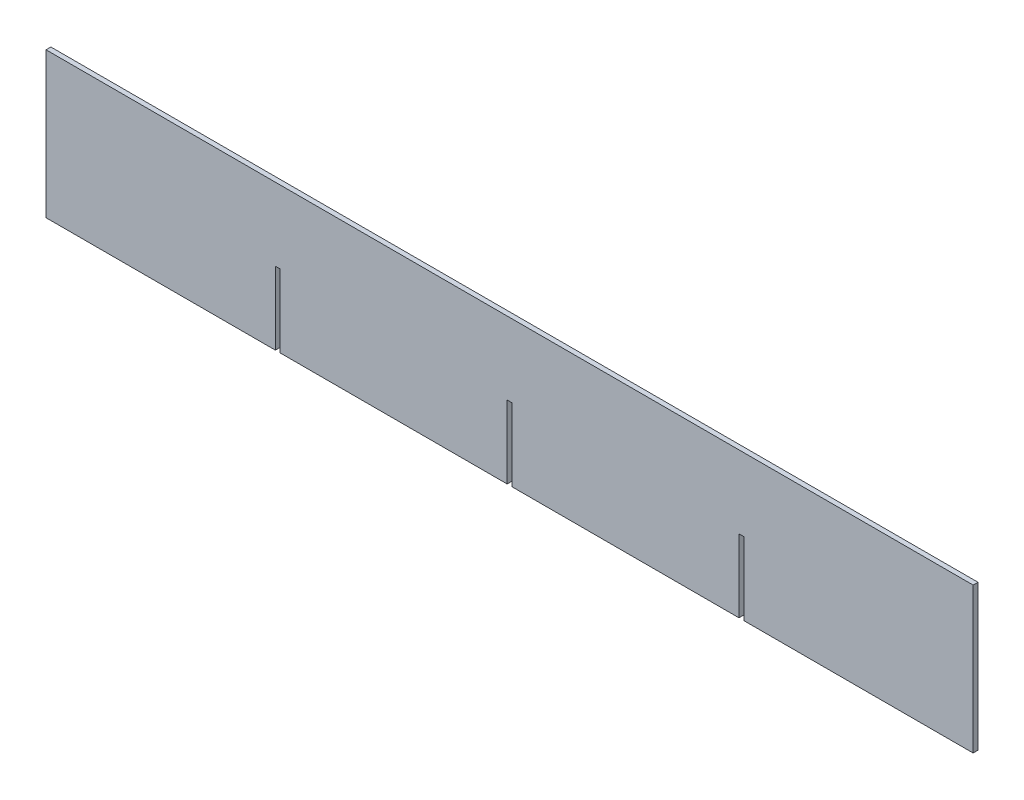
ISO-10303-21;
HEADER;
FILE_DESCRIPTION(('STEP AP214'),'2;1');
FILE_NAME('part.step','',(''),(''),'','','');
FILE_SCHEMA(('AUTOMOTIVE_DESIGN { 1 0 10303 214 1 1 1 1 }'));
ENDSEC;
DATA;
#1=APPLICATION_CONTEXT('core data for automotive mechanical design processes');
#2=APPLICATION_PROTOCOL_DEFINITION('international standard','automotive_design',2000,#1);
#3=PRODUCT_CONTEXT('',#1,'mechanical');
#4=PRODUCT('Part','Part','',(#3));
#5=PRODUCT_RELATED_PRODUCT_CATEGORY('part','',(#4));
#6=PRODUCT_DEFINITION_FORMATION('','',#4);
#7=PRODUCT_DEFINITION_CONTEXT('part definition',#1,'design');
#8=PRODUCT_DEFINITION('design','',#6,#7);
#9=PRODUCT_DEFINITION_SHAPE('','',#8);
#10=(LENGTH_UNIT() NAMED_UNIT(*) SI_UNIT(.MILLI.,.METRE.));
#11=(NAMED_UNIT(*) PLANE_ANGLE_UNIT() SI_UNIT($,.RADIAN.));
#12=(NAMED_UNIT(*) SI_UNIT($,.STERADIAN.) SOLID_ANGLE_UNIT());
#13=UNCERTAINTY_MEASURE_WITH_UNIT(LENGTH_MEASURE(1.E-05),#10,'distance_accuracy_value','');
#14=(GEOMETRIC_REPRESENTATION_CONTEXT(3) GLOBAL_UNCERTAINTY_ASSIGNED_CONTEXT((#13)) GLOBAL_UNIT_ASSIGNED_CONTEXT((#10,
#11,#12)) REPRESENTATION_CONTEXT('',''));
#15=CARTESIAN_POINT('',(0.,0.,0.));
#16=DIRECTION('',(0.,0.,1.));
#17=DIRECTION('',(1.,0.,0.));
#18=AXIS2_PLACEMENT_3D('',#15,#16,#17);
#19=CARTESIAN_POINT('',(239.,37.5,1.25));
#20=DIRECTION('',(-1.,0.,0.));
#21=DIRECTION('',(0.,0.,1.));
#22=AXIS2_PLACEMENT_3D('',#19,#20,#21);
#23=PLANE('',#22);
#24=DIRECTION('',(0.,1.,0.));
#25=VECTOR('',#24,1.);
#26=CARTESIAN_POINT('',(239.,37.5,-1.25));
#27=LINE('',#26,#25);
#28=CARTESIAN_POINT('',(239.,-37.5,-1.25));
#29=VERTEX_POINT('',#28);
#30=CARTESIAN_POINT('',(239.,37.5,-1.25));
#31=VERTEX_POINT('',#30);
#32=EDGE_CURVE('E190',#29,#31,#27,.T.);
#33=ORIENTED_EDGE('',*,*,#32,.T.);
#34=DIRECTION('',(0.,0.,-1.));
#35=VECTOR('',#34,1.);
#36=CARTESIAN_POINT('',(239.,37.5,1.25));
#37=LINE('',#36,#35);
#38=CARTESIAN_POINT('',(239.,37.5,1.25));
#39=VERTEX_POINT('',#38);
#40=EDGE_CURVE('E11',#39,#31,#37,.T.);
#41=ORIENTED_EDGE('',*,*,#40,.F.);
#42=DIRECTION('',(0.,1.,0.));
#43=VECTOR('',#42,1.);
#44=CARTESIAN_POINT('',(239.,37.5,1.25));
#45=LINE('',#44,#43);
#46=CARTESIAN_POINT('',(239.,-37.5,1.25));
#47=VERTEX_POINT('',#46);
#48=EDGE_CURVE('E236',#47,#39,#45,.T.);
#49=ORIENTED_EDGE('',*,*,#48,.F.);
#50=DIRECTION('',(0.,0.,-1.));
#51=VECTOR('',#50,1.);
#52=CARTESIAN_POINT('',(239.,-37.5,1.25));
#53=LINE('',#52,#51);
#54=EDGE_CURVE('E186',#47,#29,#53,.T.);
#55=ORIENTED_EDGE('',*,*,#54,.T.);
#56=EDGE_LOOP('',(#33,#41,#49,#55));
#57=FACE_BOUND('',#56,.T.);
#58=ADVANCED_FACE('F41',(#57),#23,.F.);
#59=CARTESIAN_POINT('',(-239.,37.5,1.25));
#60=DIRECTION('',(0.,-1.,0.));
#61=DIRECTION('',(0.,0.,-1.));
#62=AXIS2_PLACEMENT_3D('',#59,#60,#61);
#63=PLANE('',#62);
#64=DIRECTION('',(-1.,0.,0.));
#65=VECTOR('',#64,1.);
#66=CARTESIAN_POINT('',(-239.,37.5,-1.25));
#67=LINE('',#66,#65);
#68=CARTESIAN_POINT('',(-239.,37.5,-1.25));
#69=VERTEX_POINT('',#68);
#70=EDGE_CURVE('E194',#31,#69,#67,.T.);
#71=ORIENTED_EDGE('',*,*,#70,.T.);
#72=DIRECTION('',(0.,0.,-1.));
#73=VECTOR('',#72,1.);
#74=CARTESIAN_POINT('',(-239.,37.5,1.25));
#75=LINE('',#74,#73);
#76=CARTESIAN_POINT('',(-239.,37.5,1.25));
#77=VERTEX_POINT('',#76);
#78=EDGE_CURVE('E50',#77,#69,#75,.T.);
#79=ORIENTED_EDGE('',*,*,#78,.F.);
#80=DIRECTION('',(-1.,0.,0.));
#81=VECTOR('',#80,1.);
#82=CARTESIAN_POINT('',(-239.,37.5,1.25));
#83=LINE('',#82,#81);
#84=EDGE_CURVE('E125',#39,#77,#83,.T.);
#85=ORIENTED_EDGE('',*,*,#84,.F.);
#86=ORIENTED_EDGE('',*,*,#40,.T.);
#87=EDGE_LOOP('',(#71,#79,#85,#86));
#88=FACE_BOUND('',#87,.T.);
#89=ADVANCED_FACE('F358',(#88),#63,.F.);
#90=CARTESIAN_POINT('',(-239.,-37.5,1.25));
#91=DIRECTION('',(1.,0.,0.));
#92=DIRECTION('',(0.,0.,-1.));
#93=AXIS2_PLACEMENT_3D('',#90,#91,#92);
#94=PLANE('',#93);
#95=DIRECTION('',(0.,-1.,0.));
#96=VECTOR('',#95,1.);
#97=CARTESIAN_POINT('',(-239.,-37.5,-1.25));
#98=LINE('',#97,#96);
#99=CARTESIAN_POINT('',(-239.,-37.5,-1.25));
#100=VERTEX_POINT('',#99);
#101=EDGE_CURVE('E197',#69,#100,#98,.T.);
#102=ORIENTED_EDGE('',*,*,#101,.T.);
#103=DIRECTION('',(0.,0.,-1.));
#104=VECTOR('',#103,1.);
#105=CARTESIAN_POINT('',(-239.,-37.5,1.25));
#106=LINE('',#105,#104);
#107=CARTESIAN_POINT('',(-239.,-37.5,1.25));
#108=VERTEX_POINT('',#107);
#109=EDGE_CURVE('E279',#108,#100,#106,.T.);
#110=ORIENTED_EDGE('',*,*,#109,.F.);
#111=DIRECTION('',(0.,-1.,0.));
#112=VECTOR('',#111,1.);
#113=CARTESIAN_POINT('',(-239.,-37.5,1.25));
#114=LINE('',#113,#112);
#115=EDGE_CURVE('E289',#77,#108,#114,.T.);
#116=ORIENTED_EDGE('',*,*,#115,.F.);
#117=ORIENTED_EDGE('',*,*,#78,.T.);
#118=EDGE_LOOP('',(#102,#110,#116,#117));
#119=FACE_BOUND('',#118,.T.);
#120=ADVANCED_FACE('F287',(#119),#94,.F.);
#121=CARTESIAN_POINT('',(-120.75,-37.5,1.25));
#122=DIRECTION('',(0.,1.,0.));
#123=DIRECTION('',(0.,0.,1.));
#124=AXIS2_PLACEMENT_3D('',#121,#122,#123);
#125=PLANE('',#124);
#126=DIRECTION('',(1.,0.,0.));
#127=VECTOR('',#126,1.);
#128=CARTESIAN_POINT('',(-120.75,-37.5,-1.25));
#129=LINE('',#128,#127);
#130=CARTESIAN_POINT('',(-120.75,-37.5,-1.25));
#131=VERTEX_POINT('',#130);
#132=EDGE_CURVE('E200',#100,#131,#129,.T.);
#133=ORIENTED_EDGE('',*,*,#132,.T.);
#134=DIRECTION('',(0.,0.,-1.));
#135=VECTOR('',#134,1.);
#136=CARTESIAN_POINT('',(-120.75,-37.5,1.25));
#137=LINE('',#136,#135);
#138=CARTESIAN_POINT('',(-120.75,-37.5,1.25));
#139=VERTEX_POINT('',#138);
#140=EDGE_CURVE('E275',#139,#131,#137,.T.);
#141=ORIENTED_EDGE('',*,*,#140,.F.);
#142=DIRECTION('',(1.,0.,0.));
#143=VECTOR('',#142,1.);
#144=CARTESIAN_POINT('',(-120.75,-37.5,1.25));
#145=LINE('',#144,#143);
#146=EDGE_CURVE('E308',#108,#139,#145,.T.);
#147=ORIENTED_EDGE('',*,*,#146,.F.);
#148=ORIENTED_EDGE('',*,*,#109,.T.);
#149=EDGE_LOOP('',(#133,#141,#147,#148));
#150=FACE_BOUND('',#149,.T.);
#151=ADVANCED_FACE('F298',(#150),#125,.F.);
#152=CARTESIAN_POINT('',(-120.75,-37.5,1.25));
#153=DIRECTION('',(-1.,0.,0.));
#154=DIRECTION('',(0.,-1.,0.));
#155=AXIS2_PLACEMENT_3D('',#152,#153,#154);
#156=PLANE('',#155);
#157=DIRECTION('',(0.,1.,0.));
#158=VECTOR('',#157,1.);
#159=CARTESIAN_POINT('',(-120.75,-37.5,-1.25));
#160=LINE('',#159,#158);
#161=CARTESIAN_POINT('',(-120.75,0.,-1.25));
#162=VERTEX_POINT('',#161);
#163=EDGE_CURVE('E203',#131,#162,#160,.T.);
#164=ORIENTED_EDGE('',*,*,#163,.T.);
#165=DIRECTION('',(0.,0.,-1.));
#166=VECTOR('',#165,1.);
#167=CARTESIAN_POINT('',(-120.75,0.,1.25));
#168=LINE('',#167,#166);
#169=CARTESIAN_POINT('',(-120.75,0.,1.25));
#170=VERTEX_POINT('',#169);
#171=EDGE_CURVE('E271',#170,#162,#168,.T.);
#172=ORIENTED_EDGE('',*,*,#171,.F.);
#173=DIRECTION('',(0.,1.,0.));
#174=VECTOR('',#173,1.);
#175=CARTESIAN_POINT('',(-120.75,-37.5,1.25));
#176=LINE('',#175,#174);
#177=EDGE_CURVE('E304',#139,#170,#176,.T.);
#178=ORIENTED_EDGE('',*,*,#177,.F.);
#179=ORIENTED_EDGE('',*,*,#140,.T.);
#180=EDGE_LOOP('',(#164,#172,#178,#179));
#181=FACE_BOUND('',#180,.T.);
#182=ADVANCED_FACE('F302',(#181),#156,.F.);
#183=CARTESIAN_POINT('',(-120.75,0.,1.25));
#184=DIRECTION('',(0.,1.,0.));
#185=DIRECTION('',(0.,0.,1.));
#186=AXIS2_PLACEMENT_3D('',#183,#184,#185);
#187=PLANE('',#186);
#188=DIRECTION('',(1.,0.,0.));
#189=VECTOR('',#188,1.);
#190=CARTESIAN_POINT('',(-120.75,0.,-1.25));
#191=LINE('',#190,#189);
#192=CARTESIAN_POINT('',(-118.25,0.,-1.25));
#193=VERTEX_POINT('',#192);
#194=EDGE_CURVE('E206',#162,#193,#191,.T.);
#195=ORIENTED_EDGE('',*,*,#194,.T.);
#196=DIRECTION('',(0.,0.,-1.));
#197=VECTOR('',#196,1.);
#198=CARTESIAN_POINT('',(-118.25,0.,1.25));
#199=LINE('',#198,#197);
#200=CARTESIAN_POINT('',(-118.25,0.,1.25));
#201=VERTEX_POINT('',#200);
#202=EDGE_CURVE('E267',#201,#193,#199,.T.);
#203=ORIENTED_EDGE('',*,*,#202,.F.);
#204=DIRECTION('',(1.,0.,0.));
#205=VECTOR('',#204,1.);
#206=CARTESIAN_POINT('',(-120.75,0.,1.25));
#207=LINE('',#206,#205);
#208=EDGE_CURVE('E307',#170,#201,#207,.T.);
#209=ORIENTED_EDGE('',*,*,#208,.F.);
#210=ORIENTED_EDGE('',*,*,#171,.T.);
#211=EDGE_LOOP('',(#195,#203,#209,#210));
#212=FACE_BOUND('',#211,.T.);
#213=ADVANCED_FACE('F371',(#212),#187,.F.);
#214=CARTESIAN_POINT('',(-118.25,-37.5,1.25));
#215=DIRECTION('',(1.,0.,0.));
#216=DIRECTION('',(0.,0.,-1.));
#217=AXIS2_PLACEMENT_3D('',#214,#215,#216);
#218=PLANE('',#217);
#219=DIRECTION('',(0.,-1.,0.));
#220=VECTOR('',#219,1.);
#221=CARTESIAN_POINT('',(-118.25,-37.5,-1.25));
#222=LINE('',#221,#220);
#223=CARTESIAN_POINT('',(-118.25,-37.5,-1.25));
#224=VERTEX_POINT('',#223);
#225=EDGE_CURVE('E209',#193,#224,#222,.T.);
#226=ORIENTED_EDGE('',*,*,#225,.T.);
#227=DIRECTION('',(0.,0.,-1.));
#228=VECTOR('',#227,1.);
#229=CARTESIAN_POINT('',(-118.25,-37.5,1.25));
#230=LINE('',#229,#228);
#231=CARTESIAN_POINT('',(-118.25,-37.5,1.25));
#232=VERTEX_POINT('',#231);
#233=EDGE_CURVE('E263',#232,#224,#230,.T.);
#234=ORIENTED_EDGE('',*,*,#233,.F.);
#235=DIRECTION('',(0.,-1.,0.));
#236=VECTOR('',#235,1.);
#237=CARTESIAN_POINT('',(-118.25,-37.5,1.25));
#238=LINE('',#237,#236);
#239=EDGE_CURVE('E312',#201,#232,#238,.T.);
#240=ORIENTED_EDGE('',*,*,#239,.F.);
#241=ORIENTED_EDGE('',*,*,#202,.T.);
#242=EDGE_LOOP('',(#226,#234,#240,#241));
#243=FACE_BOUND('',#242,.T.);
#244=ADVANCED_FACE('F374',(#243),#218,.F.);
#245=CARTESIAN_POINT('',(-1.25000000000004,-37.5,1.25));
#246=DIRECTION('',(0.,1.,0.));
#247=DIRECTION('',(0.,0.,1.));
#248=AXIS2_PLACEMENT_3D('',#245,#246,#247);
#249=PLANE('',#248);
#250=DIRECTION('',(1.,0.,0.));
#251=VECTOR('',#250,1.);
#252=CARTESIAN_POINT('',(-1.25000000000004,-37.5,-1.25));
#253=LINE('',#252,#251);
#254=CARTESIAN_POINT('',(-1.25000000000004,-37.5,-1.25));
#255=VERTEX_POINT('',#254);
#256=EDGE_CURVE('E212',#224,#255,#253,.T.);
#257=ORIENTED_EDGE('',*,*,#256,.T.);
#258=DIRECTION('',(0.,0.,-1.));
#259=VECTOR('',#258,1.);
#260=CARTESIAN_POINT('',(-1.25000000000004,-37.5,1.25));
#261=LINE('',#260,#259);
#262=CARTESIAN_POINT('',(-1.25000000000004,-37.5,1.25));
#263=VERTEX_POINT('',#262);
#264=EDGE_CURVE('E259',#263,#255,#261,.T.);
#265=ORIENTED_EDGE('',*,*,#264,.F.);
#266=DIRECTION('',(1.,0.,0.));
#267=VECTOR('',#266,1.);
#268=CARTESIAN_POINT('',(-1.25000000000004,-37.5,1.25));
#269=LINE('',#268,#267);
#270=EDGE_CURVE('E319',#232,#263,#269,.T.);
#271=ORIENTED_EDGE('',*,*,#270,.F.);
#272=ORIENTED_EDGE('',*,*,#233,.T.);
#273=EDGE_LOOP('',(#257,#265,#271,#272));
#274=FACE_BOUND('',#273,.T.);
#275=ADVANCED_FACE('F378',(#274),#249,.F.);
#276=CARTESIAN_POINT('',(-1.25000000000004,-37.5,1.25));
#277=DIRECTION('',(-1.,0.,0.));
#278=DIRECTION('',(0.,-1.,0.));
#279=AXIS2_PLACEMENT_3D('',#276,#277,#278);
#280=PLANE('',#279);
#281=DIRECTION('',(0.,1.,0.));
#282=VECTOR('',#281,1.);
#283=CARTESIAN_POINT('',(-1.25000000000004,-37.5,-1.25));
#284=LINE('',#283,#282);
#285=CARTESIAN_POINT('',(-1.2500000000001,0.,-1.25));
#286=VERTEX_POINT('',#285);
#287=EDGE_CURVE('E215',#255,#286,#284,.T.);
#288=ORIENTED_EDGE('',*,*,#287,.T.);
#289=DIRECTION('',(0.,0.,-1.));
#290=VECTOR('',#289,1.);
#291=CARTESIAN_POINT('',(-1.2500000000001,0.,1.25));
#292=LINE('',#291,#290);
#293=CARTESIAN_POINT('',(-1.2500000000001,0.,1.25));
#294=VERTEX_POINT('',#293);
#295=EDGE_CURVE('E255',#294,#286,#292,.T.);
#296=ORIENTED_EDGE('',*,*,#295,.F.);
#297=DIRECTION('',(0.,1.,0.));
#298=VECTOR('',#297,1.);
#299=CARTESIAN_POINT('',(-1.25000000000004,-37.5,1.25));
#300=LINE('',#299,#298);
#301=EDGE_CURVE('E322',#263,#294,#300,.T.);
#302=ORIENTED_EDGE('',*,*,#301,.F.);
#303=ORIENTED_EDGE('',*,*,#264,.T.);
#304=EDGE_LOOP('',(#288,#296,#302,#303));
#305=FACE_BOUND('',#304,.T.);
#306=ADVANCED_FACE('F382',(#305),#280,.F.);
#307=CARTESIAN_POINT('',(-1.2500000000001,0.,1.25));
#308=DIRECTION('',(0.,1.,0.));
#309=DIRECTION('',(0.,0.,1.));
#310=AXIS2_PLACEMENT_3D('',#307,#308,#309);
#311=PLANE('',#310);
#312=DIRECTION('',(1.,0.,0.));
#313=VECTOR('',#312,1.);
#314=CARTESIAN_POINT('',(-1.2500000000001,0.,-1.25));
#315=LINE('',#314,#313);
#316=CARTESIAN_POINT('',(1.24999999999991,0.,-1.25));
#317=VERTEX_POINT('',#316);
#318=EDGE_CURVE('E218',#286,#317,#315,.T.);
#319=ORIENTED_EDGE('',*,*,#318,.T.);
#320=DIRECTION('',(0.,0.,-1.));
#321=VECTOR('',#320,1.);
#322=CARTESIAN_POINT('',(1.24999999999991,0.,1.25));
#323=LINE('',#322,#321);
#324=CARTESIAN_POINT('',(1.24999999999991,0.,1.25));
#325=VERTEX_POINT('',#324);
#326=EDGE_CURVE('E251',#325,#317,#323,.T.);
#327=ORIENTED_EDGE('',*,*,#326,.F.);
#328=DIRECTION('',(1.,0.,0.));
#329=VECTOR('',#328,1.);
#330=CARTESIAN_POINT('',(-1.2500000000001,0.,1.25));
#331=LINE('',#330,#329);
#332=EDGE_CURVE('E325',#294,#325,#331,.T.);
#333=ORIENTED_EDGE('',*,*,#332,.F.);
#334=ORIENTED_EDGE('',*,*,#295,.T.);
#335=EDGE_LOOP('',(#319,#327,#333,#334));
#336=FACE_BOUND('',#335,.T.);
#337=ADVANCED_FACE('F386',(#336),#311,.F.);
#338=CARTESIAN_POINT('',(1.24999999999995,-37.5,1.25));
#339=DIRECTION('',(1.,0.,0.));
#340=DIRECTION('',(0.,1.,0.));
#341=AXIS2_PLACEMENT_3D('',#338,#339,#340);
#342=PLANE('',#341);
#343=DIRECTION('',(0.,-1.,0.));
#344=VECTOR('',#343,1.);
#345=CARTESIAN_POINT('',(1.24999999999995,-37.5,-1.25));
#346=LINE('',#345,#344);
#347=CARTESIAN_POINT('',(1.24999999999995,-37.5,-1.25));
#348=VERTEX_POINT('',#347);
#349=EDGE_CURVE('E221',#317,#348,#346,.T.);
#350=ORIENTED_EDGE('',*,*,#349,.T.);
#351=DIRECTION('',(0.,0.,-1.));
#352=VECTOR('',#351,1.);
#353=CARTESIAN_POINT('',(1.24999999999995,-37.5,1.25));
#354=LINE('',#353,#352);
#355=CARTESIAN_POINT('',(1.24999999999995,-37.5,1.25));
#356=VERTEX_POINT('',#355);
#357=EDGE_CURVE('E247',#356,#348,#354,.T.);
#358=ORIENTED_EDGE('',*,*,#357,.F.);
#359=DIRECTION('',(0.,-1.,0.));
#360=VECTOR('',#359,1.);
#361=CARTESIAN_POINT('',(1.24999999999995,-37.5,1.25));
#362=LINE('',#361,#360);
#363=EDGE_CURVE('E328',#325,#356,#362,.T.);
#364=ORIENTED_EDGE('',*,*,#363,.F.);
#365=ORIENTED_EDGE('',*,*,#326,.T.);
#366=EDGE_LOOP('',(#350,#358,#364,#365));
#367=FACE_BOUND('',#366,.T.);
#368=ADVANCED_FACE('F390',(#367),#342,.F.);
#369=CARTESIAN_POINT('',(118.25,-37.5,1.25));
#370=DIRECTION('',(0.,1.,0.));
#371=DIRECTION('',(0.,0.,1.));
#372=AXIS2_PLACEMENT_3D('',#369,#370,#371);
#373=PLANE('',#372);
#374=DIRECTION('',(1.,0.,0.));
#375=VECTOR('',#374,1.);
#376=CARTESIAN_POINT('',(118.25,-37.5,-1.25));
#377=LINE('',#376,#375);
#378=CARTESIAN_POINT('',(118.25,-37.5,-1.25));
#379=VERTEX_POINT('',#378);
#380=EDGE_CURVE('E224',#348,#379,#377,.T.);
#381=ORIENTED_EDGE('',*,*,#380,.T.);
#382=DIRECTION('',(0.,0.,-1.));
#383=VECTOR('',#382,1.);
#384=CARTESIAN_POINT('',(118.25,-37.5,1.25));
#385=LINE('',#384,#383);
#386=CARTESIAN_POINT('',(118.25,-37.5,1.25));
#387=VERTEX_POINT('',#386);
#388=EDGE_CURVE('E243',#387,#379,#385,.T.);
#389=ORIENTED_EDGE('',*,*,#388,.F.);
#390=DIRECTION('',(1.,0.,0.));
#391=VECTOR('',#390,1.);
#392=CARTESIAN_POINT('',(118.25,-37.5,1.25));
#393=LINE('',#392,#391);
#394=EDGE_CURVE('E331',#356,#387,#393,.T.);
#395=ORIENTED_EDGE('',*,*,#394,.F.);
#396=ORIENTED_EDGE('',*,*,#357,.T.);
#397=EDGE_LOOP('',(#381,#389,#395,#396));
#398=FACE_BOUND('',#397,.T.);
#399=ADVANCED_FACE('F339',(#398),#373,.F.);
#400=CARTESIAN_POINT('',(118.25,-37.5,1.25));
#401=DIRECTION('',(-1.,0.,0.));
#402=DIRECTION('',(0.,-1.,0.));
#403=AXIS2_PLACEMENT_3D('',#400,#401,#402);
#404=PLANE('',#403);
#405=DIRECTION('',(0.,1.,0.));
#406=VECTOR('',#405,1.);
#407=CARTESIAN_POINT('',(118.25,-37.5,-1.25));
#408=LINE('',#407,#406);
#409=CARTESIAN_POINT('',(118.25,0.,-1.25));
#410=VERTEX_POINT('',#409);
#411=EDGE_CURVE('E227',#379,#410,#408,.T.);
#412=ORIENTED_EDGE('',*,*,#411,.T.);
#413=DIRECTION('',(0.,0.,-1.));
#414=VECTOR('',#413,1.);
#415=CARTESIAN_POINT('',(118.25,0.,1.25));
#416=LINE('',#415,#414);
#417=CARTESIAN_POINT('',(118.25,0.,1.25));
#418=VERTEX_POINT('',#417);
#419=EDGE_CURVE('E179',#418,#410,#416,.T.);
#420=ORIENTED_EDGE('',*,*,#419,.F.);
#421=DIRECTION('',(0.,1.,0.));
#422=VECTOR('',#421,1.);
#423=CARTESIAN_POINT('',(118.25,-37.5,1.25));
#424=LINE('',#423,#422);
#425=EDGE_CURVE('E168',#387,#418,#424,.T.);
#426=ORIENTED_EDGE('',*,*,#425,.F.);
#427=ORIENTED_EDGE('',*,*,#388,.T.);
#428=EDGE_LOOP('',(#412,#420,#426,#427));
#429=FACE_BOUND('',#428,.T.);
#430=ADVANCED_FACE('F343',(#429),#404,.F.);
#431=CARTESIAN_POINT('',(118.25,0.,1.25));
#432=DIRECTION('',(0.,1.,0.));
#433=DIRECTION('',(-1.,0.,0.));
#434=AXIS2_PLACEMENT_3D('',#431,#432,#433);
#435=PLANE('',#434);
#436=DIRECTION('',(1.,0.,0.));
#437=VECTOR('',#436,1.);
#438=CARTESIAN_POINT('',(118.25,0.,-1.25));
#439=LINE('',#438,#437);
#440=CARTESIAN_POINT('',(120.75,0.,-1.25));
#441=VERTEX_POINT('',#440);
#442=EDGE_CURVE('E177',#410,#441,#439,.T.);
#443=ORIENTED_EDGE('',*,*,#442,.T.);
#444=DIRECTION('',(0.,0.,-1.));
#445=VECTOR('',#444,1.);
#446=CARTESIAN_POINT('',(120.75,0.,1.25));
#447=LINE('',#446,#445);
#448=CARTESIAN_POINT('',(120.75,0.,1.25));
#449=VERTEX_POINT('',#448);
#450=EDGE_CURVE('E174',#449,#441,#447,.T.);
#451=ORIENTED_EDGE('',*,*,#450,.F.);
#452=DIRECTION('',(1.,0.,0.));
#453=VECTOR('',#452,1.);
#454=CARTESIAN_POINT('',(118.25,0.,1.25));
#455=LINE('',#454,#453);
#456=EDGE_CURVE('E162',#418,#449,#455,.T.);
#457=ORIENTED_EDGE('',*,*,#456,.F.);
#458=ORIENTED_EDGE('',*,*,#419,.T.);
#459=EDGE_LOOP('',(#443,#451,#457,#458));
#460=FACE_BOUND('',#459,.T.);
#461=ADVANCED_FACE('F175',(#460),#435,.F.);
#462=CARTESIAN_POINT('',(120.75,-37.5,1.25));
#463=DIRECTION('',(1.,0.,0.));
#464=DIRECTION('',(0.,0.,-1.));
#465=AXIS2_PLACEMENT_3D('',#462,#463,#464);
#466=PLANE('',#465);
#467=DIRECTION('',(0.,-1.,0.));
#468=VECTOR('',#467,1.);
#469=CARTESIAN_POINT('',(120.75,-37.5,-1.25));
#470=LINE('',#469,#468);
#471=CARTESIAN_POINT('',(120.75,-37.5,-1.25));
#472=VERTEX_POINT('',#471);
#473=EDGE_CURVE('E111',#441,#472,#470,.T.);
#474=ORIENTED_EDGE('',*,*,#473,.T.);
#475=DIRECTION('',(0.,0.,-1.));
#476=VECTOR('',#475,1.);
#477=CARTESIAN_POINT('',(120.75,-37.5,1.25));
#478=LINE('',#477,#476);
#479=CARTESIAN_POINT('',(120.75,-37.5,1.25));
#480=VERTEX_POINT('',#479);
#481=EDGE_CURVE('E180',#480,#472,#478,.T.);
#482=ORIENTED_EDGE('',*,*,#481,.F.);
#483=DIRECTION('',(0.,-1.,0.));
#484=VECTOR('',#483,1.);
#485=CARTESIAN_POINT('',(120.75,-37.5,1.25));
#486=LINE('',#485,#484);
#487=EDGE_CURVE('E166',#449,#480,#486,.T.);
#488=ORIENTED_EDGE('',*,*,#487,.F.);
#489=ORIENTED_EDGE('',*,*,#450,.T.);
#490=EDGE_LOOP('',(#474,#482,#488,#489));
#491=FACE_BOUND('',#490,.T.);
#492=ADVANCED_FACE('F182',(#491),#466,.F.);
#493=CARTESIAN_POINT('',(239.,-37.5,1.25));
#494=DIRECTION('',(0.,1.,0.));
#495=DIRECTION('',(0.,0.,1.));
#496=AXIS2_PLACEMENT_3D('',#493,#494,#495);
#497=PLANE('',#496);
#498=DIRECTION('',(1.,0.,0.));
#499=VECTOR('',#498,1.);
#500=CARTESIAN_POINT('',(239.,-37.5,-1.25));
#501=LINE('',#500,#499);
#502=EDGE_CURVE('E117',#472,#29,#501,.T.);
#503=ORIENTED_EDGE('',*,*,#502,.T.);
#504=ORIENTED_EDGE('',*,*,#54,.F.);
#505=DIRECTION('',(1.,0.,0.));
#506=VECTOR('',#505,1.);
#507=CARTESIAN_POINT('',(239.,-37.5,1.25));
#508=LINE('',#507,#506);
#509=EDGE_CURVE('E58',#480,#47,#508,.T.);
#510=ORIENTED_EDGE('',*,*,#509,.F.);
#511=ORIENTED_EDGE('',*,*,#481,.T.);
#512=EDGE_LOOP('',(#503,#504,#510,#511));
#513=FACE_BOUND('',#512,.T.);
#514=ADVANCED_FACE('F347',(#513),#497,.F.);
#515=CARTESIAN_POINT('',(0.,0.,1.25));
#516=DIRECTION('',(0.,0.,-1.));
#517=DIRECTION('',(-1.,0.,0.));
#518=AXIS2_PLACEMENT_3D('',#515,#516,#517);
#519=PLANE('',#518);
#520=ORIENTED_EDGE('',*,*,#48,.T.);
#521=ORIENTED_EDGE('',*,*,#84,.T.);
#522=ORIENTED_EDGE('',*,*,#115,.T.);
#523=ORIENTED_EDGE('',*,*,#146,.T.);
#524=ORIENTED_EDGE('',*,*,#177,.T.);
#525=ORIENTED_EDGE('',*,*,#208,.T.);
#526=ORIENTED_EDGE('',*,*,#239,.T.);
#527=ORIENTED_EDGE('',*,*,#270,.T.);
#528=ORIENTED_EDGE('',*,*,#301,.T.);
#529=ORIENTED_EDGE('',*,*,#332,.T.);
#530=ORIENTED_EDGE('',*,*,#363,.T.);
#531=ORIENTED_EDGE('',*,*,#394,.T.);
#532=ORIENTED_EDGE('',*,*,#425,.T.);
#533=ORIENTED_EDGE('',*,*,#456,.T.);
#534=ORIENTED_EDGE('',*,*,#487,.T.);
#535=ORIENTED_EDGE('',*,*,#509,.T.);
#536=EDGE_LOOP('',(#520,#521,#522,#523,#524,#525,#526,#527,#528,#529,#530,#531,#532,#533,#534,#535));
#537=FACE_BOUND('',#536,.T.);
#538=ADVANCED_FACE('F164',(#537),#519,.F.);
#539=CARTESIAN_POINT('',(0.,0.,-1.25));
#540=DIRECTION('',(0.,0.,-1.));
#541=DIRECTION('',(-1.,0.,0.));
#542=AXIS2_PLACEMENT_3D('',#539,#540,#541);
#543=PLANE('',#542);
#544=ORIENTED_EDGE('',*,*,#32,.F.);
#545=ORIENTED_EDGE('',*,*,#502,.F.);
#546=ORIENTED_EDGE('',*,*,#473,.F.);
#547=ORIENTED_EDGE('',*,*,#442,.F.);
#548=ORIENTED_EDGE('',*,*,#411,.F.);
#549=ORIENTED_EDGE('',*,*,#380,.F.);
#550=ORIENTED_EDGE('',*,*,#349,.F.);
#551=ORIENTED_EDGE('',*,*,#318,.F.);
#552=ORIENTED_EDGE('',*,*,#287,.F.);
#553=ORIENTED_EDGE('',*,*,#256,.F.);
#554=ORIENTED_EDGE('',*,*,#225,.F.);
#555=ORIENTED_EDGE('',*,*,#194,.F.);
#556=ORIENTED_EDGE('',*,*,#163,.F.);
#557=ORIENTED_EDGE('',*,*,#132,.F.);
#558=ORIENTED_EDGE('',*,*,#101,.F.);
#559=ORIENTED_EDGE('',*,*,#70,.F.);
#560=EDGE_LOOP('',(#544,#545,#546,#547,#548,#549,#550,#551,#552,#553,#554,#555,#556,#557,#558,#559));
#561=FACE_BOUND('',#560,.T.);
#562=ADVANCED_FACE('F293',(#561),#543,.T.);
#563=CLOSED_SHELL('',(#58,#89,#120,#151,#182,#213,#244,#275,#306,#337,#368,#399,#430,#461,#492,
#514,#538,#562));
#564=MANIFOLD_SOLID_BREP('B2',#563);
#565=ADVANCED_BREP_SHAPE_REPRESENTATION('',(#18,#564),#14);
#566=SHAPE_DEFINITION_REPRESENTATION(#9,#565);
ENDSEC;
END-ISO-10303-21;
